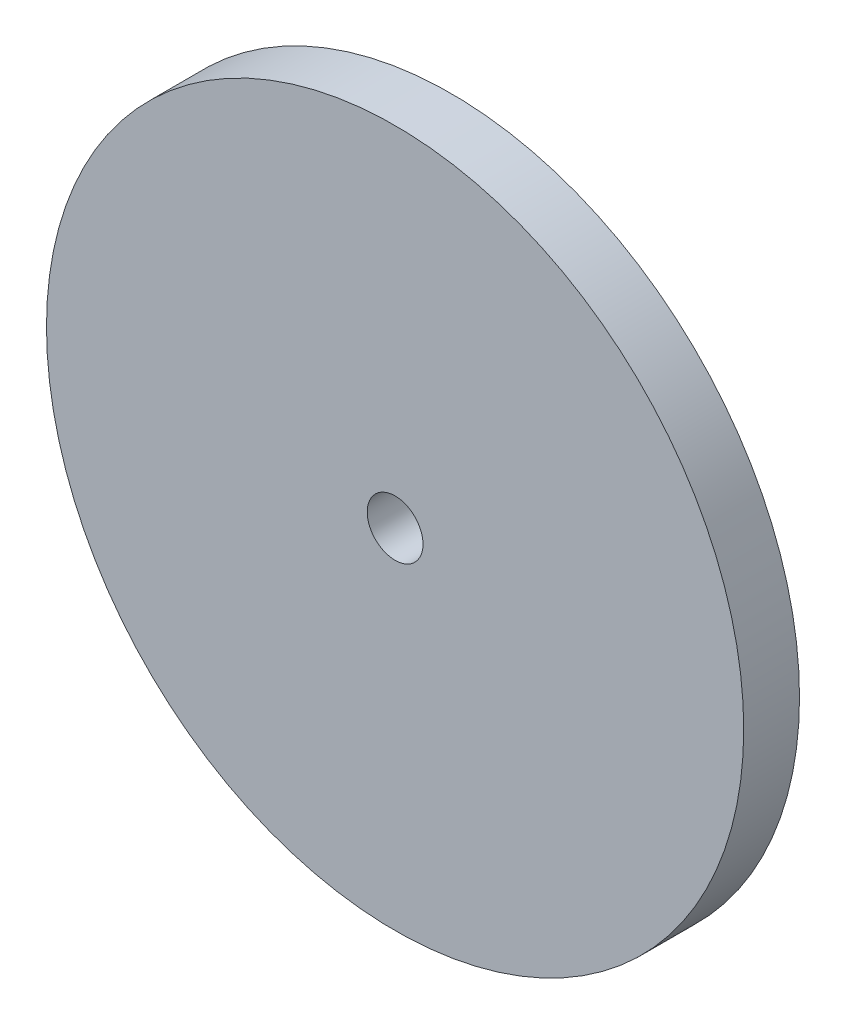
ISO-10303-21;
HEADER;
FILE_DESCRIPTION(('STEP AP214'),'2;1');
FILE_NAME('part.step','',(''),(''),'','','');
FILE_SCHEMA(('AUTOMOTIVE_DESIGN { 1 0 10303 214 1 1 1 1 }'));
ENDSEC;
DATA;
#1=APPLICATION_CONTEXT('core data for automotive mechanical design processes');
#2=APPLICATION_PROTOCOL_DEFINITION('international standard','automotive_design',2000,#1);
#3=PRODUCT_CONTEXT('',#1,'mechanical');
#4=PRODUCT('Part','Part','',(#3));
#5=PRODUCT_RELATED_PRODUCT_CATEGORY('part','',(#4));
#6=PRODUCT_DEFINITION_FORMATION('','',#4);
#7=PRODUCT_DEFINITION_CONTEXT('part definition',#1,'design');
#8=PRODUCT_DEFINITION('design','',#6,#7);
#9=PRODUCT_DEFINITION_SHAPE('','',#8);
#10=(LENGTH_UNIT() NAMED_UNIT(*) SI_UNIT(.MILLI.,.METRE.));
#11=(NAMED_UNIT(*) PLANE_ANGLE_UNIT() SI_UNIT($,.RADIAN.));
#12=(NAMED_UNIT(*) SI_UNIT($,.STERADIAN.) SOLID_ANGLE_UNIT());
#13=UNCERTAINTY_MEASURE_WITH_UNIT(LENGTH_MEASURE(1.E-05),#10,'distance_accuracy_value','');
#14=(GEOMETRIC_REPRESENTATION_CONTEXT(3) GLOBAL_UNCERTAINTY_ASSIGNED_CONTEXT((#13)) GLOBAL_UNIT_ASSIGNED_CONTEXT((#10,
#11,#12)) REPRESENTATION_CONTEXT('',''));
#15=CARTESIAN_POINT('',(0.,0.,0.));
#16=DIRECTION('',(0.,0.,1.));
#17=DIRECTION('',(1.,0.,0.));
#18=AXIS2_PLACEMENT_3D('',#15,#16,#17);
#19=CARTESIAN_POINT('',(0.,0.,20.));
#20=DIRECTION('',(0.,0.,1.));
#21=DIRECTION('',(1.,0.,0.));
#22=AXIS2_PLACEMENT_3D('',#19,#20,#21);
#23=PLANE('',#22);
#24=CARTESIAN_POINT('',(0.,0.,20.));
#25=DIRECTION('',(0.,0.,1.));
#26=DIRECTION('',(1.,0.,0.));
#27=AXIS2_PLACEMENT_3D('',#24,#25,#26);
#28=CIRCLE('',#27,125.);
#29=CARTESIAN_POINT('',(125.,0.,20.));
#30=VERTEX_POINT('',#29);
#31=EDGE_CURVE('E10',#30,#30,#28,.T.);
#32=ORIENTED_EDGE('',*,*,#31,.T.);
#33=EDGE_LOOP('',(#32));
#34=FACE_BOUND('',#33,.T.);
#35=CARTESIAN_POINT('',(0.,0.,20.));
#36=DIRECTION('',(0.,0.,1.));
#37=DIRECTION('',(1.,0.,0.));
#38=AXIS2_PLACEMENT_3D('',#35,#36,#37);
#39=CIRCLE('',#38,10.);
#40=CARTESIAN_POINT('',(10.,0.,20.));
#41=VERTEX_POINT('',#40);
#42=EDGE_CURVE('E40',#41,#41,#39,.T.);
#43=ORIENTED_EDGE('',*,*,#42,.F.);
#44=EDGE_LOOP('',(#43));
#45=FACE_BOUND('',#44,.T.);
#46=ADVANCED_FACE('F29',(#34,#45),#23,.T.);
#47=CARTESIAN_POINT('',(0.,0.,0.));
#48=DIRECTION('',(0.,0.,1.));
#49=DIRECTION('',(1.,0.,0.));
#50=AXIS2_PLACEMENT_3D('',#47,#48,#49);
#51=PLANE('',#50);
#52=CARTESIAN_POINT('',(0.,0.,0.));
#53=DIRECTION('',(0.,0.,1.));
#54=DIRECTION('',(1.,0.,0.));
#55=AXIS2_PLACEMENT_3D('',#52,#53,#54);
#56=CIRCLE('',#55,125.);
#57=CARTESIAN_POINT('',(125.,0.,0.));
#58=VERTEX_POINT('',#57);
#59=EDGE_CURVE('E33',#58,#58,#56,.T.);
#60=ORIENTED_EDGE('',*,*,#59,.F.);
#61=EDGE_LOOP('',(#60));
#62=FACE_BOUND('',#61,.T.);
#63=CARTESIAN_POINT('',(0.,0.,0.));
#64=DIRECTION('',(0.,0.,1.));
#65=DIRECTION('',(1.,0.,0.));
#66=AXIS2_PLACEMENT_3D('',#63,#64,#65);
#67=CIRCLE('',#66,10.);
#68=CARTESIAN_POINT('',(10.,0.,0.));
#69=VERTEX_POINT('',#68);
#70=EDGE_CURVE('E42',#69,#69,#67,.T.);
#71=ORIENTED_EDGE('',*,*,#70,.T.);
#72=EDGE_LOOP('',(#71));
#73=FACE_BOUND('',#72,.T.);
#74=ADVANCED_FACE('F52',(#62,#73),#51,.F.);
#75=CARTESIAN_POINT('',(0.,0.,20.));
#76=DIRECTION('',(0.,0.,-1.));
#77=DIRECTION('',(-1.,0.,0.));
#78=AXIS2_PLACEMENT_3D('',#75,#76,#77);
#79=CYLINDRICAL_SURFACE('',#78,125.);
#80=ORIENTED_EDGE('',*,*,#31,.F.);
#81=EDGE_LOOP('',(#80));
#82=FACE_BOUND('',#81,.T.);
#83=ORIENTED_EDGE('',*,*,#59,.T.);
#84=EDGE_LOOP('',(#83));
#85=FACE_BOUND('',#84,.T.);
#86=ADVANCED_FACE('F31',(#82,#85),#79,.T.);
#87=CARTESIAN_POINT('',(0.,0.,20.));
#88=DIRECTION('',(0.,0.,-1.));
#89=DIRECTION('',(-1.,0.,0.));
#90=AXIS2_PLACEMENT_3D('',#87,#88,#89);
#91=CYLINDRICAL_SURFACE('',#90,10.);
#92=ORIENTED_EDGE('',*,*,#42,.T.);
#93=EDGE_LOOP('',(#92));
#94=FACE_BOUND('',#93,.T.);
#95=ORIENTED_EDGE('',*,*,#70,.F.);
#96=EDGE_LOOP('',(#95));
#97=FACE_BOUND('',#96,.T.);
#98=ADVANCED_FACE('F48',(#94,#97),#91,.F.);
#99=CLOSED_SHELL('',(#46,#74,#86,#98));
#100=MANIFOLD_SOLID_BREP('B2',#99);
#101=ADVANCED_BREP_SHAPE_REPRESENTATION('',(#18,#100),#14);
#102=SHAPE_DEFINITION_REPRESENTATION(#9,#101);
ENDSEC;
END-ISO-10303-21;
